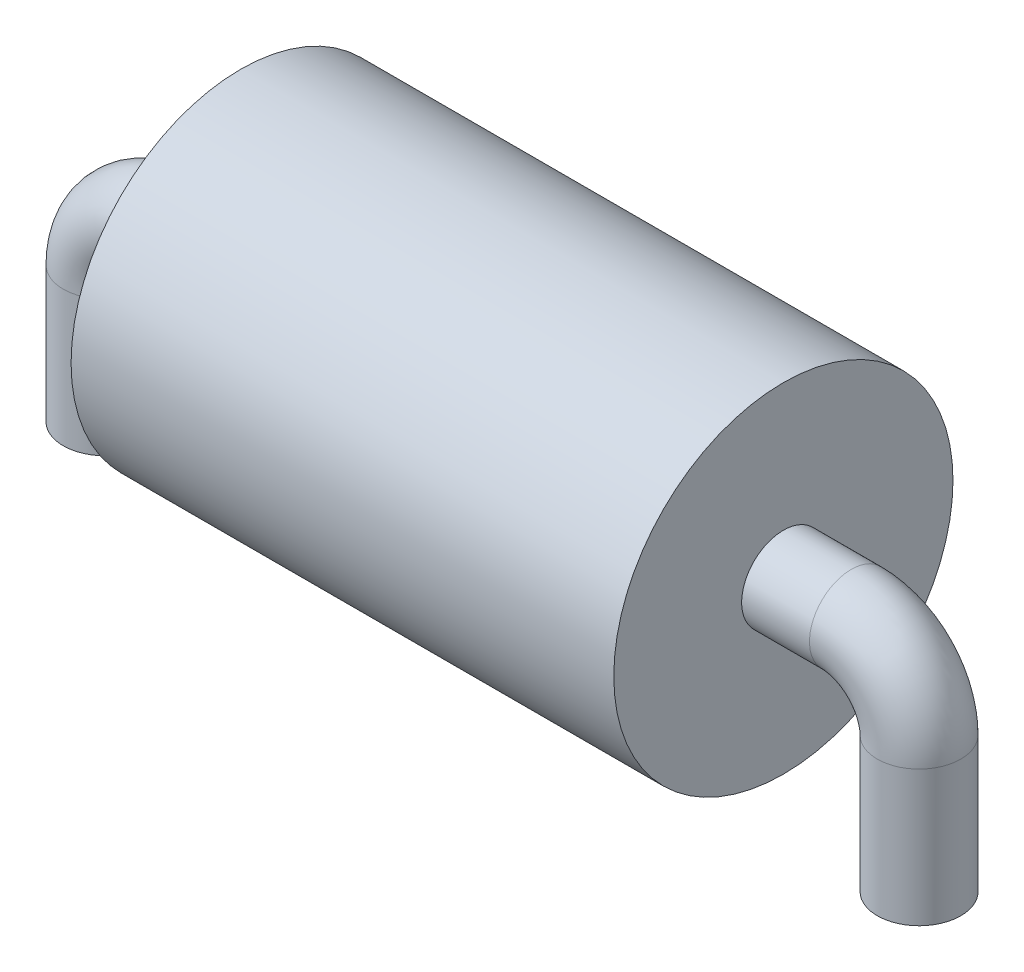
ISO-10303-21;
HEADER;
FILE_DESCRIPTION(('STEP AP214'),'2;1');
FILE_NAME('part.step','',(''),(''),'','','');
FILE_SCHEMA(('AUTOMOTIVE_DESIGN { 1 0 10303 214 1 1 1 1 }'));
ENDSEC;
DATA;
#1=APPLICATION_CONTEXT('core data for automotive mechanical design processes');
#2=APPLICATION_PROTOCOL_DEFINITION('international standard','automotive_design',2000,#1);
#3=PRODUCT_CONTEXT('',#1,'mechanical');
#4=PRODUCT('Part','Part','',(#3));
#5=PRODUCT_RELATED_PRODUCT_CATEGORY('part','',(#4));
#6=PRODUCT_DEFINITION_FORMATION('','',#4);
#7=PRODUCT_DEFINITION_CONTEXT('part definition',#1,'design');
#8=PRODUCT_DEFINITION('design','',#6,#7);
#9=PRODUCT_DEFINITION_SHAPE('','',#8);
#10=(LENGTH_UNIT() NAMED_UNIT(*) SI_UNIT(.MILLI.,.METRE.));
#11=(NAMED_UNIT(*) PLANE_ANGLE_UNIT() SI_UNIT($,.RADIAN.));
#12=(NAMED_UNIT(*) SI_UNIT($,.STERADIAN.) SOLID_ANGLE_UNIT());
#13=UNCERTAINTY_MEASURE_WITH_UNIT(LENGTH_MEASURE(1.E-05),#10,'distance_accuracy_value','');
#14=(GEOMETRIC_REPRESENTATION_CONTEXT(3) GLOBAL_UNCERTAINTY_ASSIGNED_CONTEXT((#13)) GLOBAL_UNIT_ASSIGNED_CONTEXT((#10,
#11,#12)) REPRESENTATION_CONTEXT('',''));
#15=CARTESIAN_POINT('',(0.,0.,0.));
#16=DIRECTION('',(0.,0.,1.));
#17=DIRECTION('',(1.,0.,0.));
#18=AXIS2_PLACEMENT_3D('',#15,#16,#17);
#19=CARTESIAN_POINT('',(-6.,-3.,0.));
#20=DIRECTION('',(0.,-1.,0.));
#21=DIRECTION('',(0.,0.,-1.));
#22=AXIS2_PLACEMENT_3D('',#19,#20,#21);
#23=PLANE('',#22);
#24=CARTESIAN_POINT('',(-6.,-3.,0.));
#25=DIRECTION('',(0.,-1.,0.));
#26=DIRECTION('',(0.,0.,-1.));
#27=AXIS2_PLACEMENT_3D('',#24,#25,#26);
#28=CIRCLE('',#27,0.615);
#29=CARTESIAN_POINT('',(-6.,-3.,-0.615));
#30=VERTEX_POINT('',#29);
#31=EDGE_CURVE('E18',#30,#30,#28,.F.);
#32=ORIENTED_EDGE('',*,*,#31,.F.);
#33=EDGE_LOOP('',(#32));
#34=FACE_BOUND('',#33,.T.);
#35=ADVANCED_FACE('F15',(#34),#23,.T.);
#36=CARTESIAN_POINT('',(6.,-3.,0.));
#37=DIRECTION('',(0.,-1.,0.));
#38=DIRECTION('',(0.,0.,-1.));
#39=AXIS2_PLACEMENT_3D('',#36,#37,#38);
#40=PLANE('',#39);
#41=CARTESIAN_POINT('',(6.,-3.,0.));
#42=DIRECTION('',(0.,-1.,0.));
#43=DIRECTION('',(0.,0.,-1.));
#44=AXIS2_PLACEMENT_3D('',#41,#42,#43);
#45=CIRCLE('',#44,0.615);
#46=CARTESIAN_POINT('',(6.,-3.,-0.615));
#47=VERTEX_POINT('',#46);
#48=EDGE_CURVE('E38',#47,#47,#45,.F.);
#49=ORIENTED_EDGE('',*,*,#48,.F.);
#50=EDGE_LOOP('',(#49));
#51=FACE_BOUND('',#50,.T.);
#52=ADVANCED_FACE('F50',(#51),#40,.T.);
#53=CARTESIAN_POINT('',(-6.,-1.,0.));
#54=DIRECTION('',(0.,-1.,0.));
#55=DIRECTION('',(0.,0.,-1.));
#56=AXIS2_PLACEMENT_3D('',#53,#54,#55);
#57=CYLINDRICAL_SURFACE('',#56,0.615);
#58=CARTESIAN_POINT('',(-6.,-1.,0.));
#59=DIRECTION('',(0.,-1.,0.));
#60=DIRECTION('',(-1.,0.,0.));
#61=AXIS2_PLACEMENT_3D('',#58,#59,#60);
#62=CIRCLE('',#61,0.615);
#63=CARTESIAN_POINT('',(-6.615,-1.,0.));
#64=VERTEX_POINT('',#63);
#65=EDGE_CURVE('E40',#64,#64,#62,.F.);
#66=ORIENTED_EDGE('',*,*,#65,.F.);
#67=EDGE_LOOP('',(#66));
#68=FACE_BOUND('',#67,.T.);
#69=ORIENTED_EDGE('',*,*,#31,.T.);
#70=EDGE_LOOP('',(#69));
#71=FACE_BOUND('',#70,.T.);
#72=ADVANCED_FACE('F47',(#68,#71),#57,.T.);
#73=CARTESIAN_POINT('',(6.,-1.,0.));
#74=DIRECTION('',(0.,-1.,0.));
#75=DIRECTION('',(0.,0.,-1.));
#76=AXIS2_PLACEMENT_3D('',#73,#74,#75);
#77=CYLINDRICAL_SURFACE('',#76,0.615);
#78=CARTESIAN_POINT('',(6.,-1.,0.));
#79=DIRECTION('',(0.,-1.,0.));
#80=DIRECTION('',(1.,0.,0.));
#81=AXIS2_PLACEMENT_3D('',#78,#79,#80);
#82=CIRCLE('',#81,0.615);
#83=CARTESIAN_POINT('',(6.615,-1.,0.));
#84=VERTEX_POINT('',#83);
#85=EDGE_CURVE('E30',#84,#84,#82,.F.);
#86=ORIENTED_EDGE('',*,*,#85,.F.);
#87=EDGE_LOOP('',(#86));
#88=FACE_BOUND('',#87,.T.);
#89=ORIENTED_EDGE('',*,*,#48,.T.);
#90=EDGE_LOOP('',(#89));
#91=FACE_BOUND('',#90,.T.);
#92=ADVANCED_FACE('F99',(#88,#91),#77,.T.);
#93=CARTESIAN_POINT('',(-5.,-1.,0.));
#94=DIRECTION('',(0.,0.,1.));
#95=DIRECTION('',(1.,0.,0.));
#96=AXIS2_PLACEMENT_3D('',#93,#94,#95);
#97=TOROIDAL_SURFACE('',#96,1.,0.615);
#98=ORIENTED_EDGE('',*,*,#65,.T.);
#99=EDGE_LOOP('',(#98));
#100=FACE_BOUND('',#99,.T.);
#101=CARTESIAN_POINT('',(-5.,0.,0.));
#102=DIRECTION('',(-1.,0.,0.));
#103=DIRECTION('',(0.,0.,1.));
#104=AXIS2_PLACEMENT_3D('',#101,#102,#103);
#105=CIRCLE('',#104,0.615);
#106=CARTESIAN_POINT('',(-5.,0.,0.615));
#107=VERTEX_POINT('',#106);
#108=EDGE_CURVE('E91',#107,#107,#105,.F.);
#109=ORIENTED_EDGE('',*,*,#108,.F.);
#110=EDGE_LOOP('',(#109));
#111=FACE_BOUND('',#110,.T.);
#112=ADVANCED_FACE('F83',(#100,#111),#97,.T.);
#113=CARTESIAN_POINT('',(5.,-1.,0.));
#114=DIRECTION('',(0.,0.,-1.));
#115=DIRECTION('',(-1.,0.,0.));
#116=AXIS2_PLACEMENT_3D('',#113,#114,#115);
#117=TOROIDAL_SURFACE('',#116,1.,0.615);
#118=CARTESIAN_POINT('',(5.,0.,0.));
#119=DIRECTION('',(1.,0.,0.));
#120=DIRECTION('',(0.,0.,-1.));
#121=AXIS2_PLACEMENT_3D('',#118,#119,#120);
#122=CIRCLE('',#121,0.615);
#123=CARTESIAN_POINT('',(5.,0.,-0.615));
#124=VERTEX_POINT('',#123);
#125=EDGE_CURVE('E37',#124,#124,#122,.F.);
#126=ORIENTED_EDGE('',*,*,#125,.F.);
#127=EDGE_LOOP('',(#126));
#128=FACE_BOUND('',#127,.T.);
#129=ORIENTED_EDGE('',*,*,#85,.T.);
#130=EDGE_LOOP('',(#129));
#131=FACE_BOUND('',#130,.T.);
#132=ADVANCED_FACE('F78',(#128,#131),#117,.T.);
#133=CARTESIAN_POINT('',(-4.,0.,0.));
#134=DIRECTION('',(-1.,0.,0.));
#135=DIRECTION('',(0.,0.,1.));
#136=AXIS2_PLACEMENT_3D('',#133,#134,#135);
#137=CYLINDRICAL_SURFACE('',#136,0.615);
#138=ORIENTED_EDGE('',*,*,#108,.T.);
#139=EDGE_LOOP('',(#138));
#140=FACE_BOUND('',#139,.T.);
#141=CARTESIAN_POINT('',(-4.,0.,0.));
#142=DIRECTION('',(-1.,0.,0.));
#143=DIRECTION('',(0.,0.,1.));
#144=AXIS2_PLACEMENT_3D('',#141,#142,#143);
#145=CIRCLE('',#144,0.615);
#146=CARTESIAN_POINT('',(-4.,0.,0.615));
#147=VERTEX_POINT('',#146);
#148=EDGE_CURVE('E35',#147,#147,#145,.T.);
#149=ORIENTED_EDGE('',*,*,#148,.T.);
#150=EDGE_LOOP('',(#149));
#151=FACE_BOUND('',#150,.T.);
#152=ADVANCED_FACE('F74',(#140,#151),#137,.T.);
#153=CARTESIAN_POINT('',(4.,0.,0.));
#154=DIRECTION('',(1.,0.,0.));
#155=DIRECTION('',(0.,0.,-1.));
#156=AXIS2_PLACEMENT_3D('',#153,#154,#155);
#157=CYLINDRICAL_SURFACE('',#156,0.615);
#158=CARTESIAN_POINT('',(4.,0.,0.));
#159=DIRECTION('',(1.,0.,0.));
#160=DIRECTION('',(0.,0.,-1.));
#161=AXIS2_PLACEMENT_3D('',#158,#159,#160);
#162=CIRCLE('',#161,0.615);
#163=CARTESIAN_POINT('',(4.,0.,-0.615));
#164=VERTEX_POINT('',#163);
#165=EDGE_CURVE('E27',#164,#164,#162,.F.);
#166=ORIENTED_EDGE('',*,*,#165,.F.);
#167=EDGE_LOOP('',(#166));
#168=FACE_BOUND('',#167,.T.);
#169=ORIENTED_EDGE('',*,*,#125,.T.);
#170=EDGE_LOOP('',(#169));
#171=FACE_BOUND('',#170,.T.);
#172=ADVANCED_FACE('F70',(#168,#171),#157,.T.);
#173=CARTESIAN_POINT('',(-4.,0.,0.));
#174=DIRECTION('',(1.,0.,0.));
#175=DIRECTION('',(0.,0.,-1.));
#176=AXIS2_PLACEMENT_3D('',#173,#174,#175);
#177=PLANE('',#176);
#178=CARTESIAN_POINT('',(-4.,0.,0.));
#179=DIRECTION('',(1.,0.,0.));
#180=DIRECTION('',(0.,0.,-1.));
#181=AXIS2_PLACEMENT_3D('',#178,#179,#180);
#182=CIRCLE('',#181,2.5);
#183=CARTESIAN_POINT('',(-4.,0.,-2.5));
#184=VERTEX_POINT('',#183);
#185=EDGE_CURVE('E22',#184,#184,#182,.T.);
#186=ORIENTED_EDGE('',*,*,#185,.F.);
#187=EDGE_LOOP('',(#186));
#188=FACE_BOUND('',#187,.T.);
#189=ORIENTED_EDGE('',*,*,#148,.F.);
#190=EDGE_LOOP('',(#189));
#191=FACE_BOUND('',#190,.T.);
#192=ADVANCED_FACE('F63',(#188,#191),#177,.F.);
#193=CARTESIAN_POINT('',(4.,0.,0.));
#194=DIRECTION('',(1.,0.,0.));
#195=DIRECTION('',(0.,0.,-1.));
#196=AXIS2_PLACEMENT_3D('',#193,#194,#195);
#197=PLANE('',#196);
#198=CARTESIAN_POINT('',(4.,0.,0.));
#199=DIRECTION('',(1.,0.,0.));
#200=DIRECTION('',(0.,0.,-1.));
#201=AXIS2_PLACEMENT_3D('',#198,#199,#200);
#202=CIRCLE('',#201,2.5);
#203=CARTESIAN_POINT('',(4.,0.,-2.5));
#204=VERTEX_POINT('',#203);
#205=EDGE_CURVE('E10',#204,#204,#202,.F.);
#206=ORIENTED_EDGE('',*,*,#205,.F.);
#207=EDGE_LOOP('',(#206));
#208=FACE_BOUND('',#207,.T.);
#209=ORIENTED_EDGE('',*,*,#165,.T.);
#210=EDGE_LOOP('',(#209));
#211=FACE_BOUND('',#210,.T.);
#212=ADVANCED_FACE('F58',(#208,#211),#197,.T.);
#213=CARTESIAN_POINT('',(-4.,0.,0.));
#214=DIRECTION('',(1.,0.,0.));
#215=DIRECTION('',(0.,0.,-1.));
#216=AXIS2_PLACEMENT_3D('',#213,#214,#215);
#217=CYLINDRICAL_SURFACE('',#216,2.5);
#218=ORIENTED_EDGE('',*,*,#205,.T.);
#219=EDGE_LOOP('',(#218));
#220=FACE_BOUND('',#219,.T.);
#221=ORIENTED_EDGE('',*,*,#185,.T.);
#222=EDGE_LOOP('',(#221));
#223=FACE_BOUND('',#222,.T.);
#224=ADVANCED_FACE('F56',(#220,#223),#217,.T.);
#225=CLOSED_SHELL('',(#35,#52,#72,#92,#112,#132,#152,#172,#192,#212,#224));
#226=MANIFOLD_SOLID_BREP('B1',#225);
#227=ADVANCED_BREP_SHAPE_REPRESENTATION('',(#18,#226),#14);
#228=SHAPE_DEFINITION_REPRESENTATION(#9,#227);
ENDSEC;
END-ISO-10303-21;
